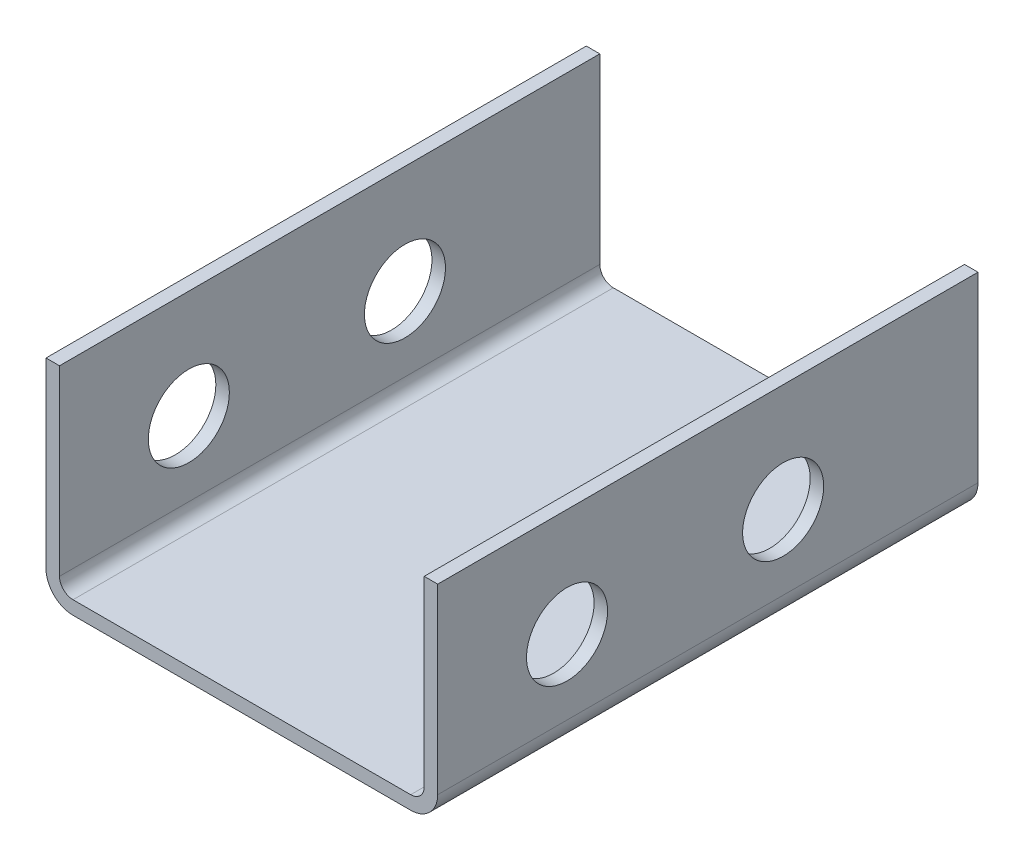
ISO-10303-21;
HEADER;
FILE_DESCRIPTION(('STEP AP214'),'2;1');
FILE_NAME('part.step','',(''),(''),'','','');
FILE_SCHEMA(('AUTOMOTIVE_DESIGN { 1 0 10303 214 1 1 1 1 }'));
ENDSEC;
DATA;
#1=APPLICATION_CONTEXT('core data for automotive mechanical design processes');
#2=APPLICATION_PROTOCOL_DEFINITION('international standard','automotive_design',2000,#1);
#3=PRODUCT_CONTEXT('',#1,'mechanical');
#4=PRODUCT('Part','Part','',(#3));
#5=PRODUCT_RELATED_PRODUCT_CATEGORY('part','',(#4));
#6=PRODUCT_DEFINITION_FORMATION('','',#4);
#7=PRODUCT_DEFINITION_CONTEXT('part definition',#1,'design');
#8=PRODUCT_DEFINITION('design','',#6,#7);
#9=PRODUCT_DEFINITION_SHAPE('','',#8);
#10=(LENGTH_UNIT() NAMED_UNIT(*) SI_UNIT(.MILLI.,.METRE.));
#11=(NAMED_UNIT(*) PLANE_ANGLE_UNIT() SI_UNIT($,.RADIAN.));
#12=(NAMED_UNIT(*) SI_UNIT($,.STERADIAN.) SOLID_ANGLE_UNIT());
#13=UNCERTAINTY_MEASURE_WITH_UNIT(LENGTH_MEASURE(1.E-05),#10,'distance_accuracy_value','');
#14=(GEOMETRIC_REPRESENTATION_CONTEXT(3) GLOBAL_UNCERTAINTY_ASSIGNED_CONTEXT((#13)) GLOBAL_UNIT_ASSIGNED_CONTEXT((#10,
#11,#12)) REPRESENTATION_CONTEXT('',''));
#15=CARTESIAN_POINT('',(0.,0.,0.));
#16=DIRECTION('',(0.,0.,1.));
#17=DIRECTION('',(1.,0.,0.));
#18=AXIS2_PLACEMENT_3D('',#15,#16,#17);
#19=CARTESIAN_POINT('',(-24.0068697123519,-13.5559898477157,46.));
#20=DIRECTION('',(-1.,0.,0.));
#21=DIRECTION('',(0.,0.,1.));
#22=AXIS2_PLACEMENT_3D('',#19,#20,#21);
#23=PLANE('',#22);
#24=CARTESIAN_POINT('',(-24.0068697123519,-9.80598984771573,15.));
#25=DIRECTION('',(1.,0.,0.));
#26=DIRECTION('',(0.,0.,-1.));
#27=AXIS2_PLACEMENT_3D('',#24,#25,#26);
#28=CIRCLE('',#27,1.5);
#29=CARTESIAN_POINT('',(-24.0068697123519,-9.80598984771573,13.5));
#30=VERTEX_POINT('',#29);
#31=EDGE_CURVE('E218',#30,#30,#28,.T.);
#32=ORIENTED_EDGE('',*,*,#31,.F.);
#33=EDGE_LOOP('',(#32));
#34=FACE_BOUND('',#33,.T.);
#35=CARTESIAN_POINT('',(-24.0068697123519,-9.80598984771573,23.));
#36=DIRECTION('',(1.,0.,0.));
#37=DIRECTION('',(0.,0.,-1.));
#38=AXIS2_PLACEMENT_3D('',#35,#36,#37);
#39=CIRCLE('',#38,1.5);
#40=CARTESIAN_POINT('',(-24.0068697123519,-9.80598984771573,21.5));
#41=VERTEX_POINT('',#40);
#42=EDGE_CURVE('E230',#41,#41,#39,.T.);
#43=ORIENTED_EDGE('',*,*,#42,.F.);
#44=EDGE_LOOP('',(#43));
#45=FACE_BOUND('',#44,.T.);
#46=DIRECTION('',(0.,0.,-1.));
#47=VECTOR('',#46,1.);
#48=CARTESIAN_POINT('',(-24.0068697123519,-5.80598984771573,46.));
#49=LINE('',#48,#47);
#50=CARTESIAN_POINT('',(-24.0068697123519,-5.80598984771573,27.7872823447427));
#51=VERTEX_POINT('',#50);
#52=CARTESIAN_POINT('',(-24.0068697123519,-5.80598984771573,7.78728234474271));
#53=VERTEX_POINT('',#52);
#54=EDGE_CURVE('E176',#51,#53,#49,.T.);
#55=ORIENTED_EDGE('',*,*,#54,.F.);
#56=DIRECTION('',(0.,1.,0.));
#57=VECTOR('',#56,1.);
#58=CARTESIAN_POINT('',(-24.0068697123519,-5.80598984771573,27.7872823447427));
#59=LINE('',#58,#57);
#60=CARTESIAN_POINT('',(-24.0068697123519,-12.5559898477157,27.7872823447427));
#61=VERTEX_POINT('',#60);
#62=EDGE_CURVE('E153',#61,#51,#59,.T.);
#63=ORIENTED_EDGE('',*,*,#62,.F.);
#64=DIRECTION('',(0.,0.,-1.));
#65=VECTOR('',#64,1.);
#66=CARTESIAN_POINT('',(-24.0068697123519,-12.5559898477157,46.));
#67=LINE('',#66,#65);
#68=CARTESIAN_POINT('',(-24.0068697123519,-12.5559898477157,7.78728234474271));
#69=VERTEX_POINT('',#68);
#70=EDGE_CURVE('E67',#61,#69,#67,.T.);
#71=ORIENTED_EDGE('',*,*,#70,.T.);
#72=DIRECTION('',(0.,-1.,0.));
#73=VECTOR('',#72,1.);
#74=CARTESIAN_POINT('',(-24.0068697123519,-5.80598984771573,7.78728234474271));
#75=LINE('',#74,#73);
#76=EDGE_CURVE('E192',#53,#69,#75,.T.);
#77=ORIENTED_EDGE('',*,*,#76,.F.);
#78=EDGE_LOOP('',(#55,#63,#71,#77));
#79=FACE_BOUND('',#78,.T.);
#80=ADVANCED_FACE('F46',(#34,#45,#79),#23,.F.);
#81=CARTESIAN_POINT('',(-24.5068697123519,-5.80598984771573,46.));
#82=DIRECTION('',(0.,1.,0.));
#83=DIRECTION('',(0.,0.,1.));
#84=AXIS2_PLACEMENT_3D('',#81,#82,#83);
#85=PLANE('',#84);
#86=DIRECTION('',(1.,0.,0.));
#87=VECTOR('',#86,1.);
#88=CARTESIAN_POINT('',(-38.5068697123519,-5.80598984771573,27.7872823447427));
#89=LINE('',#88,#87);
#90=CARTESIAN_POINT('',(-24.5068697123519,-5.80598984771573,27.7872823447427));
#91=VERTEX_POINT('',#90);
#92=EDGE_CURVE('E144',#91,#51,#89,.T.);
#93=ORIENTED_EDGE('',*,*,#92,.T.);
#94=ORIENTED_EDGE('',*,*,#54,.T.);
#95=DIRECTION('',(1.,0.,0.));
#96=VECTOR('',#95,1.);
#97=CARTESIAN_POINT('',(-38.5068697123519,-5.80598984771573,7.78728234474271));
#98=LINE('',#97,#96);
#99=CARTESIAN_POINT('',(-24.5068697123519,-5.80598984771573,7.78728234474271));
#100=VERTEX_POINT('',#99);
#101=EDGE_CURVE('E200',#100,#53,#98,.T.);
#102=ORIENTED_EDGE('',*,*,#101,.F.);
#103=DIRECTION('',(0.,0.,-1.));
#104=VECTOR('',#103,1.);
#105=CARTESIAN_POINT('',(-24.5068697123519,-5.80598984771573,46.));
#106=LINE('',#105,#104);
#107=EDGE_CURVE('E174',#91,#100,#106,.T.);
#108=ORIENTED_EDGE('',*,*,#107,.F.);
#109=EDGE_LOOP('',(#93,#94,#102,#108));
#110=FACE_BOUND('',#109,.T.);
#111=ADVANCED_FACE('F251',(#110),#85,.T.);
#112=CARTESIAN_POINT('',(-24.5068697123519,-13.5559898477157,46.));
#113=DIRECTION('',(-1.,0.,0.));
#114=DIRECTION('',(0.,0.,1.));
#115=AXIS2_PLACEMENT_3D('',#112,#113,#114);
#116=PLANE('',#115);
#117=DIRECTION('',(0.,-1.,0.));
#118=VECTOR('',#117,1.);
#119=CARTESIAN_POINT('',(-24.5068697123519,-13.5559898477157,27.7872823447427));
#120=LINE('',#119,#118);
#121=CARTESIAN_POINT('',(-24.5068697123519,-12.5559898477157,27.7872823447427));
#122=VERTEX_POINT('',#121);
#123=EDGE_CURVE('E277',#91,#122,#120,.T.);
#124=ORIENTED_EDGE('',*,*,#123,.F.);
#125=ORIENTED_EDGE('',*,*,#107,.T.);
#126=DIRECTION('',(0.,1.,0.));
#127=VECTOR('',#126,1.);
#128=CARTESIAN_POINT('',(-24.5068697123519,-13.5559898477157,7.78728234474271));
#129=LINE('',#128,#127);
#130=CARTESIAN_POINT('',(-24.5068697123519,-12.5559898477157,7.78728234474271));
#131=VERTEX_POINT('',#130);
#132=EDGE_CURVE('E216',#131,#100,#129,.T.);
#133=ORIENTED_EDGE('',*,*,#132,.F.);
#134=DIRECTION('',(0.,0.,-1.));
#135=VECTOR('',#134,1.);
#136=CARTESIAN_POINT('',(-24.5068697123519,-12.5559898477157,46.));
#137=LINE('',#136,#135);
#138=EDGE_CURVE('E172',#122,#131,#137,.T.);
#139=ORIENTED_EDGE('',*,*,#138,.F.);
#140=EDGE_LOOP('',(#124,#125,#133,#139));
#141=FACE_BOUND('',#140,.T.);
#142=CARTESIAN_POINT('',(-24.5068697123519,-9.80598984771573,15.));
#143=DIRECTION('',(-1.,0.,0.));
#144=DIRECTION('',(0.,0.,1.));
#145=AXIS2_PLACEMENT_3D('',#142,#143,#144);
#146=CIRCLE('',#145,1.5);
#147=CARTESIAN_POINT('',(-24.5068697123519,-9.80598984771573,16.5));
#148=VERTEX_POINT('',#147);
#149=EDGE_CURVE('E227',#148,#148,#146,.T.);
#150=ORIENTED_EDGE('',*,*,#149,.F.);
#151=EDGE_LOOP('',(#150));
#152=FACE_BOUND('',#151,.T.);
#153=CARTESIAN_POINT('',(-24.5068697123519,-9.80598984771573,23.));
#154=DIRECTION('',(-1.,0.,0.));
#155=DIRECTION('',(0.,0.,1.));
#156=AXIS2_PLACEMENT_3D('',#153,#154,#155);
#157=CIRCLE('',#156,1.5);
#158=CARTESIAN_POINT('',(-24.5068697123519,-9.80598984771573,24.5));
#159=VERTEX_POINT('',#158);
#160=EDGE_CURVE('E239',#159,#159,#157,.T.);
#161=ORIENTED_EDGE('',*,*,#160,.F.);
#162=EDGE_LOOP('',(#161));
#163=FACE_BOUND('',#162,.T.);
#164=ADVANCED_FACE('F248',(#141,#152,#163),#116,.T.);
#165=CARTESIAN_POINT('',(-25.0068697123519,-12.5559898477157,46.));
#166=DIRECTION('',(0.,0.,-1.));
#167=DIRECTION('',(-1.,0.,0.));
#168=AXIS2_PLACEMENT_3D('',#165,#166,#167);
#169=CYLINDRICAL_SURFACE('',#168,0.5);
#170=CARTESIAN_POINT('',(-25.0068697123519,-12.5559898477157,27.7872823447427));
#171=DIRECTION('',(0.,0.,-1.));
#172=DIRECTION('',(-1.,0.,0.));
#173=AXIS2_PLACEMENT_3D('',#170,#171,#172);
#174=CIRCLE('',#173,0.5);
#175=CARTESIAN_POINT('',(-25.0068697123519,-13.0559898477157,27.7872823447427));
#176=VERTEX_POINT('',#175);
#177=EDGE_CURVE('E280',#122,#176,#174,.T.);
#178=ORIENTED_EDGE('',*,*,#177,.F.);
#179=ORIENTED_EDGE('',*,*,#138,.T.);
#180=CARTESIAN_POINT('',(-25.0068697123519,-12.5559898477157,7.78728234474271));
#181=DIRECTION('',(0.,0.,1.));
#182=DIRECTION('',(0.,-1.,0.));
#183=AXIS2_PLACEMENT_3D('',#180,#181,#182);
#184=CIRCLE('',#183,0.5);
#185=CARTESIAN_POINT('',(-25.0068697123519,-13.0559898477157,7.78728234474271));
#186=VERTEX_POINT('',#185);
#187=EDGE_CURVE('E213',#186,#131,#184,.T.);
#188=ORIENTED_EDGE('',*,*,#187,.F.);
#189=DIRECTION('',(0.,0.,-1.));
#190=VECTOR('',#189,1.);
#191=CARTESIAN_POINT('',(-25.0068697123519,-13.0559898477157,46.));
#192=LINE('',#191,#190);
#193=EDGE_CURVE('E170',#176,#186,#192,.T.);
#194=ORIENTED_EDGE('',*,*,#193,.F.);
#195=EDGE_LOOP('',(#178,#179,#188,#194));
#196=FACE_BOUND('',#195,.T.);
#197=ADVANCED_FACE('F250',(#196),#169,.F.);
#198=CARTESIAN_POINT('',(-38.5068697123519,-13.0559898477157,46.));
#199=DIRECTION('',(0.,1.,0.));
#200=DIRECTION('',(-1.,0.,0.));
#201=AXIS2_PLACEMENT_3D('',#198,#199,#200);
#202=PLANE('',#201);
#203=DIRECTION('',(-1.,0.,0.));
#204=VECTOR('',#203,1.);
#205=CARTESIAN_POINT('',(-38.5068697123519,-13.0559898477157,27.7872823447427));
#206=LINE('',#205,#204);
#207=CARTESIAN_POINT('',(-37.5068697123519,-13.0559898477157,27.7872823447427));
#208=VERTEX_POINT('',#207);
#209=EDGE_CURVE('E282',#176,#208,#206,.T.);
#210=ORIENTED_EDGE('',*,*,#209,.F.);
#211=ORIENTED_EDGE('',*,*,#193,.T.);
#212=DIRECTION('',(1.,0.,0.));
#213=VECTOR('',#212,1.);
#214=CARTESIAN_POINT('',(-38.5068697123519,-13.0559898477157,7.78728234474271));
#215=LINE('',#214,#213);
#216=CARTESIAN_POINT('',(-37.5068697123519,-13.0559898477157,7.78728234474271));
#217=VERTEX_POINT('',#216);
#218=EDGE_CURVE('E210',#217,#186,#215,.T.);
#219=ORIENTED_EDGE('',*,*,#218,.F.);
#220=DIRECTION('',(0.,0.,-1.));
#221=VECTOR('',#220,1.);
#222=CARTESIAN_POINT('',(-37.5068697123519,-13.0559898477157,46.));
#223=LINE('',#222,#221);
#224=EDGE_CURVE('E168',#208,#217,#223,.T.);
#225=ORIENTED_EDGE('',*,*,#224,.F.);
#226=EDGE_LOOP('',(#210,#211,#219,#225));
#227=FACE_BOUND('',#226,.T.);
#228=ADVANCED_FACE('F258',(#227),#202,.T.);
#229=CARTESIAN_POINT('',(-37.5068697123519,-12.5559898477157,46.));
#230=DIRECTION('',(0.,0.,-1.));
#231=DIRECTION('',(-1.,0.,0.));
#232=AXIS2_PLACEMENT_3D('',#229,#230,#231);
#233=CYLINDRICAL_SURFACE('',#232,0.5);
#234=CARTESIAN_POINT('',(-37.5068697123519,-12.5559898477157,27.7872823447427));
#235=DIRECTION('',(0.,0.,-1.));
#236=DIRECTION('',(-1.,0.,0.));
#237=AXIS2_PLACEMENT_3D('',#234,#235,#236);
#238=CIRCLE('',#237,0.5);
#239=CARTESIAN_POINT('',(-38.0068697123519,-12.5559898477157,27.7872823447427));
#240=VERTEX_POINT('',#239);
#241=EDGE_CURVE('E284',#208,#240,#238,.T.);
#242=ORIENTED_EDGE('',*,*,#241,.F.);
#243=ORIENTED_EDGE('',*,*,#224,.T.);
#244=CARTESIAN_POINT('',(-37.5068697123519,-12.5559898477157,7.78728234474271));
#245=DIRECTION('',(0.,0.,1.));
#246=DIRECTION('',(0.,-1.,0.));
#247=AXIS2_PLACEMENT_3D('',#244,#245,#246);
#248=CIRCLE('',#247,0.5);
#249=CARTESIAN_POINT('',(-38.0068697123519,-12.5559898477157,7.78728234474272));
#250=VERTEX_POINT('',#249);
#251=EDGE_CURVE('E207',#250,#217,#248,.T.);
#252=ORIENTED_EDGE('',*,*,#251,.F.);
#253=DIRECTION('',(0.,0.,-1.));
#254=VECTOR('',#253,1.);
#255=CARTESIAN_POINT('',(-38.0068697123519,-12.5559898477157,46.));
#256=LINE('',#255,#254);
#257=EDGE_CURVE('E161',#240,#250,#256,.T.);
#258=ORIENTED_EDGE('',*,*,#257,.F.);
#259=EDGE_LOOP('',(#242,#243,#252,#258));
#260=FACE_BOUND('',#259,.T.);
#261=ADVANCED_FACE('F301',(#260),#233,.F.);
#262=CARTESIAN_POINT('',(-38.0068697123519,-5.80598984771574,46.));
#263=DIRECTION('',(1.,0.,0.));
#264=DIRECTION('',(0.,1.,0.));
#265=AXIS2_PLACEMENT_3D('',#262,#263,#264);
#266=PLANE('',#265);
#267=DIRECTION('',(0.,1.,0.));
#268=VECTOR('',#267,1.);
#269=CARTESIAN_POINT('',(-38.0068697123519,-5.80598984771574,27.7872823447427));
#270=LINE('',#269,#268);
#271=CARTESIAN_POINT('',(-38.0068697123519,-5.80598984771573,27.7872823447427));
#272=VERTEX_POINT('',#271);
#273=EDGE_CURVE('E139',#240,#272,#270,.T.);
#274=ORIENTED_EDGE('',*,*,#273,.F.);
#275=ORIENTED_EDGE('',*,*,#257,.T.);
#276=DIRECTION('',(0.,-1.,0.));
#277=VECTOR('',#276,1.);
#278=CARTESIAN_POINT('',(-38.0068697123519,-5.80598984771575,7.78728234474271));
#279=LINE('',#278,#277);
#280=CARTESIAN_POINT('',(-38.0068697123519,-5.80598984771573,7.78728234474271));
#281=VERTEX_POINT('',#280);
#282=EDGE_CURVE('E198',#281,#250,#279,.T.);
#283=ORIENTED_EDGE('',*,*,#282,.F.);
#284=DIRECTION('',(0.,0.,-1.));
#285=VECTOR('',#284,1.);
#286=CARTESIAN_POINT('',(-38.0068697123519,-5.80598984771574,46.));
#287=LINE('',#286,#285);
#288=EDGE_CURVE('E159',#272,#281,#287,.T.);
#289=ORIENTED_EDGE('',*,*,#288,.F.);
#290=EDGE_LOOP('',(#274,#275,#283,#289));
#291=FACE_BOUND('',#290,.T.);
#292=CARTESIAN_POINT('',(-38.0068697123519,-9.80598984771573,15.));
#293=DIRECTION('',(1.,0.,0.));
#294=DIRECTION('',(0.,1.,0.));
#295=AXIS2_PLACEMENT_3D('',#292,#293,#294);
#296=CIRCLE('',#295,1.5);
#297=CARTESIAN_POINT('',(-38.0068697123519,-8.30598984771573,15.));
#298=VERTEX_POINT('',#297);
#299=EDGE_CURVE('E222',#298,#298,#296,.T.);
#300=ORIENTED_EDGE('',*,*,#299,.F.);
#301=EDGE_LOOP('',(#300));
#302=FACE_BOUND('',#301,.T.);
#303=CARTESIAN_POINT('',(-38.0068697123519,-9.80598984771573,23.));
#304=DIRECTION('',(1.,0.,0.));
#305=DIRECTION('',(0.,1.,0.));
#306=AXIS2_PLACEMENT_3D('',#303,#304,#305);
#307=CIRCLE('',#306,1.5);
#308=CARTESIAN_POINT('',(-38.0068697123519,-8.30598984771573,23.));
#309=VERTEX_POINT('',#308);
#310=EDGE_CURVE('E234',#309,#309,#307,.T.);
#311=ORIENTED_EDGE('',*,*,#310,.F.);
#312=EDGE_LOOP('',(#311));
#313=FACE_BOUND('',#312,.T.);
#314=ADVANCED_FACE('F304',(#291,#302,#313),#266,.T.);
#315=CARTESIAN_POINT('',(-38.5068697123519,-5.80598984771574,46.));
#316=DIRECTION('',(0.,1.,0.));
#317=DIRECTION('',(-1.,0.,0.));
#318=AXIS2_PLACEMENT_3D('',#315,#316,#317);
#319=PLANE('',#318);
#320=CARTESIAN_POINT('',(-38.5068697123519,-5.80598984771573,27.7872823447427));
#321=VERTEX_POINT('',#320);
#322=EDGE_CURVE('E133',#321,#272,#89,.T.);
#323=ORIENTED_EDGE('',*,*,#322,.T.);
#324=ORIENTED_EDGE('',*,*,#288,.T.);
#325=CARTESIAN_POINT('',(-38.5068697123519,-5.80598984771573,7.78728234474271));
#326=VERTEX_POINT('',#325);
#327=EDGE_CURVE('E158',#326,#281,#98,.T.);
#328=ORIENTED_EDGE('',*,*,#327,.F.);
#329=DIRECTION('',(0.,0.,-1.));
#330=VECTOR('',#329,1.);
#331=CARTESIAN_POINT('',(-38.5068697123519,-5.80598984771574,46.));
#332=LINE('',#331,#330);
#333=EDGE_CURVE('E150',#321,#326,#332,.T.);
#334=ORIENTED_EDGE('',*,*,#333,.F.);
#335=EDGE_LOOP('',(#323,#324,#328,#334));
#336=FACE_BOUND('',#335,.T.);
#337=ADVANCED_FACE('F156',(#336),#319,.T.);
#338=CARTESIAN_POINT('',(-38.5068697123519,-5.80598984771574,46.));
#339=DIRECTION('',(1.,0.,0.));
#340=DIRECTION('',(0.,1.,0.));
#341=AXIS2_PLACEMENT_3D('',#338,#339,#340);
#342=PLANE('',#341);
#343=CARTESIAN_POINT('',(-38.5068697123519,-9.80598984771573,15.));
#344=DIRECTION('',(1.,0.,0.));
#345=DIRECTION('',(0.,0.,-1.));
#346=AXIS2_PLACEMENT_3D('',#343,#344,#345);
#347=CIRCLE('',#346,1.5);
#348=CARTESIAN_POINT('',(-38.5068697123519,-9.80598984771573,13.5));
#349=VERTEX_POINT('',#348);
#350=EDGE_CURVE('E219',#349,#349,#347,.T.);
#351=ORIENTED_EDGE('',*,*,#350,.T.);
#352=EDGE_LOOP('',(#351));
#353=FACE_BOUND('',#352,.T.);
#354=CARTESIAN_POINT('',(-38.5068697123519,-9.80598984771573,23.));
#355=DIRECTION('',(1.,0.,0.));
#356=DIRECTION('',(0.,0.,-1.));
#357=AXIS2_PLACEMENT_3D('',#354,#355,#356);
#358=CIRCLE('',#357,1.5);
#359=CARTESIAN_POINT('',(-38.5068697123519,-9.80598984771573,21.5));
#360=VERTEX_POINT('',#359);
#361=EDGE_CURVE('E231',#360,#360,#358,.T.);
#362=ORIENTED_EDGE('',*,*,#361,.T.);
#363=EDGE_LOOP('',(#362));
#364=FACE_BOUND('',#363,.T.);
#365=DIRECTION('',(0.,0.,-1.));
#366=VECTOR('',#365,1.);
#367=CARTESIAN_POINT('',(-38.5068697123519,-12.5559898477157,46.));
#368=LINE('',#367,#366);
#369=CARTESIAN_POINT('',(-38.5068697123519,-12.5559898477157,27.7872823447427));
#370=VERTEX_POINT('',#369);
#371=CARTESIAN_POINT('',(-38.5068697123519,-12.5559898477157,7.78728234474271));
#372=VERTEX_POINT('',#371);
#373=EDGE_CURVE('E152',#370,#372,#368,.T.);
#374=ORIENTED_EDGE('',*,*,#373,.F.);
#375=DIRECTION('',(0.,1.,0.));
#376=VECTOR('',#375,1.);
#377=CARTESIAN_POINT('',(-38.5068697123519,-5.80598984771573,27.7872823447427));
#378=LINE('',#377,#376);
#379=EDGE_CURVE('E136',#370,#321,#378,.T.);
#380=ORIENTED_EDGE('',*,*,#379,.T.);
#381=ORIENTED_EDGE('',*,*,#333,.T.);
#382=DIRECTION('',(0.,-1.,0.));
#383=VECTOR('',#382,1.);
#384=CARTESIAN_POINT('',(-38.5068697123519,-5.80598984771573,7.78728234474271));
#385=LINE('',#384,#383);
#386=EDGE_CURVE('E276',#326,#372,#385,.T.);
#387=ORIENTED_EDGE('',*,*,#386,.T.);
#388=EDGE_LOOP('',(#374,#380,#381,#387));
#389=FACE_BOUND('',#388,.T.);
#390=ADVANCED_FACE('F148',(#353,#364,#389),#342,.F.);
#391=CARTESIAN_POINT('',(-37.5068697123519,-12.5559898477157,46.));
#392=DIRECTION('',(0.,0.,-1.));
#393=DIRECTION('',(-1.,0.,0.));
#394=AXIS2_PLACEMENT_3D('',#391,#392,#393);
#395=CYLINDRICAL_SURFACE('',#394,1.);
#396=DIRECTION('',(0.,0.,-1.));
#397=VECTOR('',#396,1.);
#398=CARTESIAN_POINT('',(-37.5068697123519,-13.5559898477157,46.));
#399=LINE('',#398,#397);
#400=CARTESIAN_POINT('',(-37.5068697123519,-13.5559898477157,27.7872823447427));
#401=VERTEX_POINT('',#400);
#402=CARTESIAN_POINT('',(-37.5068697123519,-13.5559898477157,7.78728234474271));
#403=VERTEX_POINT('',#402);
#404=EDGE_CURVE('E163',#401,#403,#399,.T.);
#405=ORIENTED_EDGE('',*,*,#404,.F.);
#406=CARTESIAN_POINT('',(-37.5068697123519,-12.5559898477157,27.7872823447427));
#407=DIRECTION('',(0.,0.,-1.));
#408=DIRECTION('',(-1.,0.,0.));
#409=AXIS2_PLACEMENT_3D('',#406,#407,#408);
#410=CIRCLE('',#409,1.);
#411=EDGE_CURVE('E143',#401,#370,#410,.T.);
#412=ORIENTED_EDGE('',*,*,#411,.T.);
#413=ORIENTED_EDGE('',*,*,#373,.T.);
#414=CARTESIAN_POINT('',(-37.5068697123519,-12.5559898477157,7.78728234474271));
#415=DIRECTION('',(0.,0.,1.));
#416=DIRECTION('',(0.,-1.,0.));
#417=AXIS2_PLACEMENT_3D('',#414,#415,#416);
#418=CIRCLE('',#417,1.);
#419=EDGE_CURVE('E196',#372,#403,#418,.T.);
#420=ORIENTED_EDGE('',*,*,#419,.T.);
#421=EDGE_LOOP('',(#405,#412,#413,#420));
#422=FACE_BOUND('',#421,.T.);
#423=ADVANCED_FACE('F307',(#422),#395,.T.);
#424=CARTESIAN_POINT('',(-38.5068697123519,-13.5559898477157,46.));
#425=DIRECTION('',(0.,1.,0.));
#426=DIRECTION('',(-1.,0.,0.));
#427=AXIS2_PLACEMENT_3D('',#424,#425,#426);
#428=PLANE('',#427);
#429=DIRECTION('',(0.,0.,-1.));
#430=VECTOR('',#429,1.);
#431=CARTESIAN_POINT('',(-25.0068697123519,-13.5559898477157,46.));
#432=LINE('',#431,#430);
#433=CARTESIAN_POINT('',(-25.0068697123519,-13.5559898477157,27.7872823447427));
#434=VERTEX_POINT('',#433);
#435=CARTESIAN_POINT('',(-25.0068697123519,-13.5559898477157,7.78728234474271));
#436=VERTEX_POINT('',#435);
#437=EDGE_CURVE('E182',#434,#436,#432,.T.);
#438=ORIENTED_EDGE('',*,*,#437,.F.);
#439=DIRECTION('',(1.,0.,0.));
#440=VECTOR('',#439,1.);
#441=CARTESIAN_POINT('',(-38.5068697123519,-13.5559898477157,27.7872823447427));
#442=LINE('',#441,#440);
#443=EDGE_CURVE('E60',#401,#434,#442,.T.);
#444=ORIENTED_EDGE('',*,*,#443,.F.);
#445=ORIENTED_EDGE('',*,*,#404,.T.);
#446=DIRECTION('',(1.,0.,0.));
#447=VECTOR('',#446,1.);
#448=CARTESIAN_POINT('',(-38.5068697123519,-13.5559898477157,7.78728234474271));
#449=LINE('',#448,#447);
#450=EDGE_CURVE('E189',#403,#436,#449,.T.);
#451=ORIENTED_EDGE('',*,*,#450,.T.);
#452=EDGE_LOOP('',(#438,#444,#445,#451));
#453=FACE_BOUND('',#452,.T.);
#454=ADVANCED_FACE('F194',(#453),#428,.F.);
#455=CARTESIAN_POINT('',(-25.0068697123519,-12.5559898477157,46.));
#456=DIRECTION('',(0.,0.,-1.));
#457=DIRECTION('',(-1.,0.,0.));
#458=AXIS2_PLACEMENT_3D('',#455,#456,#457);
#459=CYLINDRICAL_SURFACE('',#458,1.);
#460=ORIENTED_EDGE('',*,*,#70,.F.);
#461=CARTESIAN_POINT('',(-25.0068697123519,-12.5559898477157,27.7872823447427));
#462=DIRECTION('',(0.,0.,-1.));
#463=DIRECTION('',(-1.,0.,0.));
#464=AXIS2_PLACEMENT_3D('',#461,#462,#463);
#465=CIRCLE('',#464,1.);
#466=EDGE_CURVE('E13',#61,#434,#465,.T.);
#467=ORIENTED_EDGE('',*,*,#466,.T.);
#468=ORIENTED_EDGE('',*,*,#437,.T.);
#469=CARTESIAN_POINT('',(-25.0068697123519,-12.5559898477157,7.78728234474271));
#470=DIRECTION('',(0.,0.,1.));
#471=DIRECTION('',(0.,-1.,0.));
#472=AXIS2_PLACEMENT_3D('',#469,#470,#471);
#473=CIRCLE('',#472,1.);
#474=EDGE_CURVE('E53',#436,#69,#473,.T.);
#475=ORIENTED_EDGE('',*,*,#474,.T.);
#476=EDGE_LOOP('',(#460,#467,#468,#475));
#477=FACE_BOUND('',#476,.T.);
#478=ADVANCED_FACE('F180',(#477),#459,.T.);
#479=CARTESIAN_POINT('',(-38.5068697123519,-9.80598984771573,23.));
#480=DIRECTION('',(1.,0.,0.));
#481=DIRECTION('',(0.,0.,-1.));
#482=AXIS2_PLACEMENT_3D('',#479,#480,#481);
#483=CYLINDRICAL_SURFACE('',#482,1.5);
#484=ORIENTED_EDGE('',*,*,#310,.T.);
#485=EDGE_LOOP('',(#484));
#486=FACE_BOUND('',#485,.T.);
#487=ORIENTED_EDGE('',*,*,#361,.F.);
#488=EDGE_LOOP('',(#487));
#489=FACE_BOUND('',#488,.T.);
#490=ADVANCED_FACE('F368',(#486,#489),#483,.F.);
#491=ORIENTED_EDGE('',*,*,#160,.T.);
#492=EDGE_LOOP('',(#491));
#493=FACE_BOUND('',#492,.T.);
#494=ORIENTED_EDGE('',*,*,#42,.T.);
#495=EDGE_LOOP('',(#494));
#496=FACE_BOUND('',#495,.T.);
#497=ADVANCED_FACE('F245',(#493,#496),#483,.F.);
#498=CARTESIAN_POINT('',(-38.5068697123519,-9.80598984771573,15.));
#499=DIRECTION('',(1.,0.,0.));
#500=DIRECTION('',(0.,0.,-1.));
#501=AXIS2_PLACEMENT_3D('',#498,#499,#500);
#502=CYLINDRICAL_SURFACE('',#501,1.5);
#503=ORIENTED_EDGE('',*,*,#299,.T.);
#504=EDGE_LOOP('',(#503));
#505=FACE_BOUND('',#504,.T.);
#506=ORIENTED_EDGE('',*,*,#350,.F.);
#507=EDGE_LOOP('',(#506));
#508=FACE_BOUND('',#507,.T.);
#509=ADVANCED_FACE('F387',(#505,#508),#502,.F.);
#510=ORIENTED_EDGE('',*,*,#149,.T.);
#511=EDGE_LOOP('',(#510));
#512=FACE_BOUND('',#511,.T.);
#513=ORIENTED_EDGE('',*,*,#31,.T.);
#514=EDGE_LOOP('',(#513));
#515=FACE_BOUND('',#514,.T.);
#516=ADVANCED_FACE('F396',(#512,#515),#502,.F.);
#517=CARTESIAN_POINT('',(-38.5068697123519,-5.80598984771573,7.78728234474271));
#518=DIRECTION('',(0.,0.,1.));
#519=DIRECTION('',(0.,-1.,0.));
#520=AXIS2_PLACEMENT_3D('',#517,#518,#519);
#521=PLANE('',#520);
#522=ORIENTED_EDGE('',*,*,#132,.T.);
#523=ORIENTED_EDGE('',*,*,#101,.T.);
#524=ORIENTED_EDGE('',*,*,#76,.T.);
#525=ORIENTED_EDGE('',*,*,#474,.F.);
#526=ORIENTED_EDGE('',*,*,#450,.F.);
#527=ORIENTED_EDGE('',*,*,#419,.F.);
#528=ORIENTED_EDGE('',*,*,#386,.F.);
#529=ORIENTED_EDGE('',*,*,#327,.T.);
#530=ORIENTED_EDGE('',*,*,#282,.T.);
#531=ORIENTED_EDGE('',*,*,#251,.T.);
#532=ORIENTED_EDGE('',*,*,#218,.T.);
#533=ORIENTED_EDGE('',*,*,#187,.T.);
#534=EDGE_LOOP('',(#522,#523,#524,#525,#526,#527,#528,#529,#530,#531,#532,#533));
#535=FACE_BOUND('',#534,.T.);
#536=ADVANCED_FACE('F187',(#535),#521,.F.);
#537=CARTESIAN_POINT('',(-38.5068697123519,-5.80598984771573,27.7872823447427));
#538=DIRECTION('',(0.,0.,-1.));
#539=DIRECTION('',(-1.,0.,0.));
#540=AXIS2_PLACEMENT_3D('',#537,#538,#539);
#541=PLANE('',#540);
#542=ORIENTED_EDGE('',*,*,#123,.T.);
#543=ORIENTED_EDGE('',*,*,#177,.T.);
#544=ORIENTED_EDGE('',*,*,#209,.T.);
#545=ORIENTED_EDGE('',*,*,#241,.T.);
#546=ORIENTED_EDGE('',*,*,#273,.T.);
#547=ORIENTED_EDGE('',*,*,#322,.F.);
#548=ORIENTED_EDGE('',*,*,#379,.F.);
#549=ORIENTED_EDGE('',*,*,#411,.F.);
#550=ORIENTED_EDGE('',*,*,#443,.T.);
#551=ORIENTED_EDGE('',*,*,#466,.F.);
#552=ORIENTED_EDGE('',*,*,#62,.T.);
#553=ORIENTED_EDGE('',*,*,#92,.F.);
#554=EDGE_LOOP('',(#542,#543,#544,#545,#546,#547,#548,#549,#550,#551,#552,#553));
#555=FACE_BOUND('',#554,.T.);
#556=ADVANCED_FACE('F135',(#555),#541,.F.);
#557=CLOSED_SHELL('',(#80,#111,#164,#197,#228,#261,#314,#337,#390,#423,#454,#478,#490,#497,#509,
#516,#536,#556));
#558=MANIFOLD_SOLID_BREP('B2',#557);
#559=ADVANCED_BREP_SHAPE_REPRESENTATION('',(#18,#558),#14);
#560=SHAPE_DEFINITION_REPRESENTATION(#9,#559);
ENDSEC;
END-ISO-10303-21;
